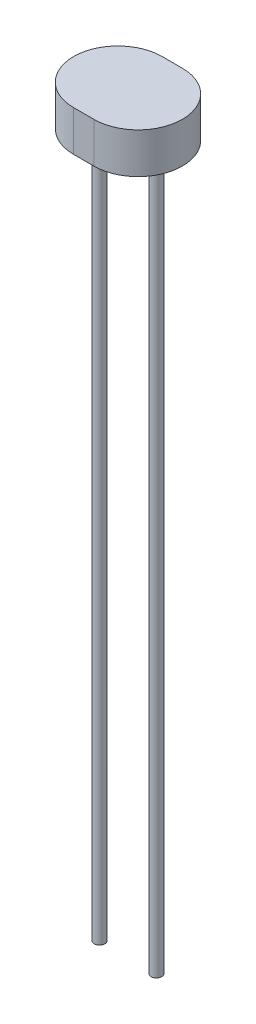
ISO-10303-21;
HEADER;
FILE_DESCRIPTION(('STEP AP214'),'2;1');
FILE_NAME('part.step','',(''),(''),'','','');
FILE_SCHEMA(('AUTOMOTIVE_DESIGN { 1 0 10303 214 1 1 1 1 }'));
ENDSEC;
DATA;
#1=APPLICATION_CONTEXT('core data for automotive mechanical design processes');
#2=APPLICATION_PROTOCOL_DEFINITION('international standard','automotive_design',2000,#1);
#3=PRODUCT_CONTEXT('',#1,'mechanical');
#4=PRODUCT('Part','Part','',(#3));
#5=PRODUCT_RELATED_PRODUCT_CATEGORY('part','',(#4));
#6=PRODUCT_DEFINITION_FORMATION('','',#4);
#7=PRODUCT_DEFINITION_CONTEXT('part definition',#1,'design');
#8=PRODUCT_DEFINITION('design','',#6,#7);
#9=PRODUCT_DEFINITION_SHAPE('','',#8);
#10=(LENGTH_UNIT() NAMED_UNIT(*) SI_UNIT(.MILLI.,.METRE.));
#11=(NAMED_UNIT(*) PLANE_ANGLE_UNIT() SI_UNIT($,.RADIAN.));
#12=(NAMED_UNIT(*) SI_UNIT($,.STERADIAN.) SOLID_ANGLE_UNIT());
#13=UNCERTAINTY_MEASURE_WITH_UNIT(LENGTH_MEASURE(1.E-05),#10,'distance_accuracy_value','');
#14=(GEOMETRIC_REPRESENTATION_CONTEXT(3) GLOBAL_UNCERTAINTY_ASSIGNED_CONTEXT((#13)) GLOBAL_UNIT_ASSIGNED_CONTEXT((#10,
#11,#12)) REPRESENTATION_CONTEXT('',''));
#15=CARTESIAN_POINT('',(0.,0.,0.));
#16=DIRECTION('',(0.,0.,1.));
#17=DIRECTION('',(1.,0.,0.));
#18=AXIS2_PLACEMENT_3D('',#15,#16,#17);
#19=CARTESIAN_POINT('',(-0.475,1.9,0.));
#20=DIRECTION('',(0.,-1.,0.));
#21=DIRECTION('',(0.,0.,-1.));
#22=AXIS2_PLACEMENT_3D('',#19,#20,#21);
#23=CYLINDRICAL_SURFACE('',#22,2.075);
#24=CARTESIAN_POINT('',(-0.475,0.,0.));
#25=DIRECTION('',(0.,1.,0.));
#26=DIRECTION('',(0.,0.,1.));
#27=AXIS2_PLACEMENT_3D('',#24,#25,#26);
#28=CIRCLE('',#27,2.075);
#29=CARTESIAN_POINT('',(-0.475,0.,-2.075));
#30=VERTEX_POINT('',#29);
#31=CARTESIAN_POINT('',(-0.475,0.,2.075));
#32=VERTEX_POINT('',#31);
#33=EDGE_CURVE('E101',#30,#32,#28,.T.);
#34=ORIENTED_EDGE('',*,*,#33,.T.);
#35=DIRECTION('',(0.,-1.,0.));
#36=VECTOR('',#35,1.);
#37=CARTESIAN_POINT('',(-0.475,1.9,2.075));
#38=LINE('',#37,#36);
#39=CARTESIAN_POINT('',(-0.475,1.9,2.075));
#40=VERTEX_POINT('',#39);
#41=EDGE_CURVE('E92',#40,#32,#38,.T.);
#42=ORIENTED_EDGE('',*,*,#41,.F.);
#43=CARTESIAN_POINT('',(-0.475,1.9,0.));
#44=DIRECTION('',(0.,1.,0.));
#45=DIRECTION('',(0.,0.,1.));
#46=AXIS2_PLACEMENT_3D('',#43,#44,#45);
#47=CIRCLE('',#46,2.075);
#48=CARTESIAN_POINT('',(-0.475,1.9,-2.075));
#49=VERTEX_POINT('',#48);
#50=EDGE_CURVE('E86',#49,#40,#47,.T.);
#51=ORIENTED_EDGE('',*,*,#50,.F.);
#52=DIRECTION('',(0.,-1.,0.));
#53=VECTOR('',#52,1.);
#54=CARTESIAN_POINT('',(-0.475,1.9,-2.075));
#55=LINE('',#54,#53);
#56=EDGE_CURVE('E97',#49,#30,#55,.T.);
#57=ORIENTED_EDGE('',*,*,#56,.T.);
#58=EDGE_LOOP('',(#34,#42,#51,#57));
#59=FACE_BOUND('',#58,.T.);
#60=ADVANCED_FACE('F34',(#59),#23,.T.);
#61=CARTESIAN_POINT('',(-0.475,1.9,2.075));
#62=DIRECTION('',(0.,0.,-1.));
#63=DIRECTION('',(-1.,0.,0.));
#64=AXIS2_PLACEMENT_3D('',#61,#62,#63);
#65=PLANE('',#64);
#66=DIRECTION('',(1.,0.,0.));
#67=VECTOR('',#66,1.);
#68=CARTESIAN_POINT('',(-0.475,0.,2.075));
#69=LINE('',#68,#67);
#70=CARTESIAN_POINT('',(0.475000000000001,0.,2.075));
#71=VERTEX_POINT('',#70);
#72=EDGE_CURVE('E91',#32,#71,#69,.T.);
#73=ORIENTED_EDGE('',*,*,#72,.T.);
#74=DIRECTION('',(0.,-1.,0.));
#75=VECTOR('',#74,1.);
#76=CARTESIAN_POINT('',(0.475000000000001,1.9,2.075));
#77=LINE('',#76,#75);
#78=CARTESIAN_POINT('',(0.475000000000001,1.9,2.075));
#79=VERTEX_POINT('',#78);
#80=EDGE_CURVE('E89',#79,#71,#77,.T.);
#81=ORIENTED_EDGE('',*,*,#80,.F.);
#82=DIRECTION('',(1.,0.,0.));
#83=VECTOR('',#82,1.);
#84=CARTESIAN_POINT('',(-0.475,1.9,2.075));
#85=LINE('',#84,#83);
#86=EDGE_CURVE('E81',#40,#79,#85,.T.);
#87=ORIENTED_EDGE('',*,*,#86,.F.);
#88=ORIENTED_EDGE('',*,*,#41,.T.);
#89=EDGE_LOOP('',(#73,#81,#87,#88));
#90=FACE_BOUND('',#89,.T.);
#91=ADVANCED_FACE('F90',(#90),#65,.F.);
#92=CARTESIAN_POINT('',(0.475,1.9,0.));
#93=DIRECTION('',(0.,-1.,0.));
#94=DIRECTION('',(0.,0.,-1.));
#95=AXIS2_PLACEMENT_3D('',#92,#93,#94);
#96=CYLINDRICAL_SURFACE('',#95,2.075);
#97=CARTESIAN_POINT('',(0.475,0.,0.));
#98=DIRECTION('',(0.,1.,0.));
#99=DIRECTION('',(0.,0.,1.));
#100=AXIS2_PLACEMENT_3D('',#97,#98,#99);
#101=CIRCLE('',#100,2.075);
#102=CARTESIAN_POINT('',(0.474999999999999,0.,-2.075));
#103=VERTEX_POINT('',#102);
#104=EDGE_CURVE('E67',#71,#103,#101,.T.);
#105=ORIENTED_EDGE('',*,*,#104,.T.);
#106=DIRECTION('',(0.,-1.,0.));
#107=VECTOR('',#106,1.);
#108=CARTESIAN_POINT('',(0.474999999999999,1.9,-2.075));
#109=LINE('',#108,#107);
#110=CARTESIAN_POINT('',(0.474999999999999,1.9,-2.075));
#111=VERTEX_POINT('',#110);
#112=EDGE_CURVE('E93',#111,#103,#109,.T.);
#113=ORIENTED_EDGE('',*,*,#112,.F.);
#114=CARTESIAN_POINT('',(0.475,1.9,0.));
#115=DIRECTION('',(0.,1.,0.));
#116=DIRECTION('',(0.,0.,1.));
#117=AXIS2_PLACEMENT_3D('',#114,#115,#116);
#118=CIRCLE('',#117,2.075);
#119=EDGE_CURVE('E84',#79,#111,#118,.T.);
#120=ORIENTED_EDGE('',*,*,#119,.F.);
#121=ORIENTED_EDGE('',*,*,#80,.T.);
#122=EDGE_LOOP('',(#105,#113,#120,#121));
#123=FACE_BOUND('',#122,.T.);
#124=ADVANCED_FACE('F95',(#123),#96,.T.);
#125=CARTESIAN_POINT('',(-0.475,1.9,-2.075));
#126=DIRECTION('',(0.,0.,1.));
#127=DIRECTION('',(1.,0.,0.));
#128=AXIS2_PLACEMENT_3D('',#125,#126,#127);
#129=PLANE('',#128);
#130=DIRECTION('',(-1.,0.,0.));
#131=VECTOR('',#130,1.);
#132=CARTESIAN_POINT('',(-0.475,0.,-2.075));
#133=LINE('',#132,#131);
#134=EDGE_CURVE('E73',#103,#30,#133,.T.);
#135=ORIENTED_EDGE('',*,*,#134,.T.);
#136=ORIENTED_EDGE('',*,*,#56,.F.);
#137=DIRECTION('',(-1.,0.,0.));
#138=VECTOR('',#137,1.);
#139=CARTESIAN_POINT('',(-0.475,1.9,-2.075));
#140=LINE('',#139,#138);
#141=EDGE_CURVE('E50',#111,#49,#140,.T.);
#142=ORIENTED_EDGE('',*,*,#141,.F.);
#143=ORIENTED_EDGE('',*,*,#112,.T.);
#144=EDGE_LOOP('',(#135,#136,#142,#143));
#145=FACE_BOUND('',#144,.T.);
#146=ADVANCED_FACE('F122',(#145),#129,.F.);
#147=CARTESIAN_POINT('',(-0.475,1.9,0.));
#148=DIRECTION('',(0.,1.,0.));
#149=DIRECTION('',(0.,0.,1.));
#150=AXIS2_PLACEMENT_3D('',#147,#148,#149);
#151=PLANE('',#150);
#152=ORIENTED_EDGE('',*,*,#50,.T.);
#153=ORIENTED_EDGE('',*,*,#86,.T.);
#154=ORIENTED_EDGE('',*,*,#119,.T.);
#155=ORIENTED_EDGE('',*,*,#141,.T.);
#156=EDGE_LOOP('',(#152,#153,#154,#155));
#157=FACE_BOUND('',#156,.T.);
#158=ADVANCED_FACE('F82',(#157),#151,.T.);
#159=CARTESIAN_POINT('',(-0.475,0.,0.));
#160=DIRECTION('',(0.,1.,0.));
#161=DIRECTION('',(0.,0.,1.));
#162=AXIS2_PLACEMENT_3D('',#159,#160,#161);
#163=PLANE('',#162);
#164=CARTESIAN_POINT('',(1.33371264397152,0.,0.));
#165=DIRECTION('',(0.,1.,0.));
#166=DIRECTION('',(0.,0.,1.));
#167=AXIS2_PLACEMENT_3D('',#164,#165,#166);
#168=CIRCLE('',#167,0.25);
#169=CARTESIAN_POINT('',(1.33371264397152,0.,0.25));
#170=VERTEX_POINT('',#169);
#171=EDGE_CURVE('E11',#170,#170,#168,.F.);
#172=ORIENTED_EDGE('',*,*,#171,.F.);
#173=EDGE_LOOP('',(#172));
#174=FACE_BOUND('',#173,.T.);
#175=CARTESIAN_POINT('',(-1.33371264397152,0.,0.));
#176=DIRECTION('',(0.,1.,0.));
#177=DIRECTION('',(0.,0.,1.));
#178=AXIS2_PLACEMENT_3D('',#175,#176,#177);
#179=CIRCLE('',#178,0.25);
#180=CARTESIAN_POINT('',(-1.33371264397152,0.,0.25));
#181=VERTEX_POINT('',#180);
#182=EDGE_CURVE('E42',#181,#181,#179,.F.);
#183=ORIENTED_EDGE('',*,*,#182,.F.);
#184=EDGE_LOOP('',(#183));
#185=FACE_BOUND('',#184,.T.);
#186=ORIENTED_EDGE('',*,*,#33,.F.);
#187=ORIENTED_EDGE('',*,*,#134,.F.);
#188=ORIENTED_EDGE('',*,*,#104,.F.);
#189=ORIENTED_EDGE('',*,*,#72,.F.);
#190=EDGE_LOOP('',(#186,#187,#188,#189));
#191=FACE_BOUND('',#190,.T.);
#192=ADVANCED_FACE('F115',(#174,#185,#191),#163,.F.);
#193=CARTESIAN_POINT('',(-1.33371264397152,-33.4,0.));
#194=DIRECTION('',(0.,1.,0.));
#195=DIRECTION('',(0.,0.,1.));
#196=AXIS2_PLACEMENT_3D('',#193,#194,#195);
#197=CYLINDRICAL_SURFACE('',#196,0.25);
#198=CARTESIAN_POINT('',(-1.33371264397152,-33.4,0.));
#199=DIRECTION('',(0.,-1.,0.));
#200=DIRECTION('',(0.,0.,-1.));
#201=AXIS2_PLACEMENT_3D('',#198,#199,#200);
#202=CIRCLE('',#201,0.25);
#203=CARTESIAN_POINT('',(-1.33371264397152,-33.4,-0.25));
#204=VERTEX_POINT('',#203);
#205=EDGE_CURVE('E104',#204,#204,#202,.T.);
#206=ORIENTED_EDGE('',*,*,#205,.F.);
#207=EDGE_LOOP('',(#206));
#208=FACE_BOUND('',#207,.T.);
#209=ORIENTED_EDGE('',*,*,#182,.T.);
#210=EDGE_LOOP('',(#209));
#211=FACE_BOUND('',#210,.T.);
#212=ADVANCED_FACE('F113',(#208,#211),#197,.T.);
#213=CARTESIAN_POINT('',(-1.33371264397152,-33.4,0.));
#214=DIRECTION('',(0.,-1.,0.));
#215=DIRECTION('',(0.,0.,-1.));
#216=AXIS2_PLACEMENT_3D('',#213,#214,#215);
#217=PLANE('',#216);
#218=ORIENTED_EDGE('',*,*,#205,.T.);
#219=EDGE_LOOP('',(#218));
#220=FACE_BOUND('',#219,.T.);
#221=ADVANCED_FACE('F166',(#220),#217,.T.);
#222=CARTESIAN_POINT('',(1.33371264397152,-33.4,0.));
#223=DIRECTION('',(0.,1.,0.));
#224=DIRECTION('',(0.,0.,1.));
#225=AXIS2_PLACEMENT_3D('',#222,#223,#224);
#226=CYLINDRICAL_SURFACE('',#225,0.25);
#227=CARTESIAN_POINT('',(1.33371264397152,-33.4,0.));
#228=DIRECTION('',(0.,-1.,0.));
#229=DIRECTION('',(0.,0.,1.));
#230=AXIS2_PLACEMENT_3D('',#227,#228,#229);
#231=CIRCLE('',#230,0.25);
#232=CARTESIAN_POINT('',(1.33371264397152,-33.4,0.25));
#233=VERTEX_POINT('',#232);
#234=EDGE_CURVE('E202',#233,#233,#231,.T.);
#235=ORIENTED_EDGE('',*,*,#234,.F.);
#236=EDGE_LOOP('',(#235));
#237=FACE_BOUND('',#236,.T.);
#238=ORIENTED_EDGE('',*,*,#171,.T.);
#239=EDGE_LOOP('',(#238));
#240=FACE_BOUND('',#239,.T.);
#241=ADVANCED_FACE('F176',(#237,#240),#226,.T.);
#242=CARTESIAN_POINT('',(1.33371264397152,-33.4,0.));
#243=DIRECTION('',(0.,1.,0.));
#244=DIRECTION('',(0.,0.,1.));
#245=AXIS2_PLACEMENT_3D('',#242,#243,#244);
#246=PLANE('',#245);
#247=ORIENTED_EDGE('',*,*,#234,.T.);
#248=EDGE_LOOP('',(#247));
#249=FACE_BOUND('',#248,.T.);
#250=ADVANCED_FACE('F186',(#249),#246,.F.);
#251=CLOSED_SHELL('',(#60,#91,#124,#146,#158,#192,#212,#221,#241,#250));
#252=MANIFOLD_SOLID_BREP('B2',#251);
#253=ADVANCED_BREP_SHAPE_REPRESENTATION('',(#18,#252),#14);
#254=SHAPE_DEFINITION_REPRESENTATION(#9,#253);
ENDSEC;
END-ISO-10303-21;
